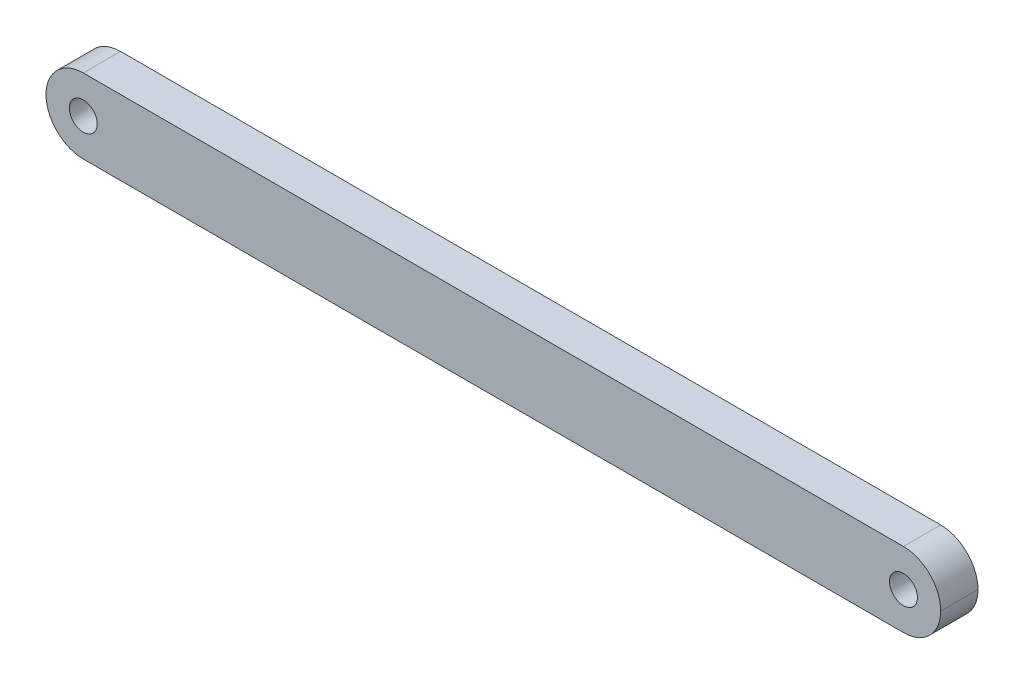
ISO-10303-21;
HEADER;
FILE_DESCRIPTION(('STEP AP214'),'2;1');
FILE_NAME('part.step','',(''),(''),'','','');
FILE_SCHEMA(('AUTOMOTIVE_DESIGN { 1 0 10303 214 1 1 1 1 }'));
ENDSEC;
DATA;
#1=APPLICATION_CONTEXT('core data for automotive mechanical design processes');
#2=APPLICATION_PROTOCOL_DEFINITION('international standard','automotive_design',2000,#1);
#3=PRODUCT_CONTEXT('',#1,'mechanical');
#4=PRODUCT('Part','Part','',(#3));
#5=PRODUCT_RELATED_PRODUCT_CATEGORY('part','',(#4));
#6=PRODUCT_DEFINITION_FORMATION('','',#4);
#7=PRODUCT_DEFINITION_CONTEXT('part definition',#1,'design');
#8=PRODUCT_DEFINITION('design','',#6,#7);
#9=PRODUCT_DEFINITION_SHAPE('','',#8);
#10=(LENGTH_UNIT() NAMED_UNIT(*) SI_UNIT(.MILLI.,.METRE.));
#11=(NAMED_UNIT(*) PLANE_ANGLE_UNIT() SI_UNIT($,.RADIAN.));
#12=(NAMED_UNIT(*) SI_UNIT($,.STERADIAN.) SOLID_ANGLE_UNIT());
#13=UNCERTAINTY_MEASURE_WITH_UNIT(LENGTH_MEASURE(1.E-05),#10,'distance_accuracy_value','');
#14=(GEOMETRIC_REPRESENTATION_CONTEXT(3) GLOBAL_UNCERTAINTY_ASSIGNED_CONTEXT((#13)) GLOBAL_UNIT_ASSIGNED_CONTEXT((#10,
#11,#12)) REPRESENTATION_CONTEXT('',''));
#15=CARTESIAN_POINT('',(0.,0.,0.));
#16=DIRECTION('',(0.,0.,1.));
#17=DIRECTION('',(1.,0.,0.));
#18=AXIS2_PLACEMENT_3D('',#15,#16,#17);
#19=CARTESIAN_POINT('',(0.,0.,6.35));
#20=DIRECTION('',(0.,1.,0.));
#21=DIRECTION('',(0.,0.,1.));
#22=AXIS2_PLACEMENT_3D('',#19,#20,#21);
#23=PLANE('',#22);
#24=DIRECTION('',(1.,0.,0.));
#25=VECTOR('',#24,1.);
#26=CARTESIAN_POINT('',(0.,0.,6.35));
#27=LINE('',#26,#25);
#28=CARTESIAN_POINT('',(6.35,0.,6.35));
#29=VERTEX_POINT('',#28);
#30=CARTESIAN_POINT('',(146.05,0.,6.35));
#31=VERTEX_POINT('',#30);
#32=EDGE_CURVE('E106',#29,#31,#27,.T.);
#33=ORIENTED_EDGE('',*,*,#32,.F.);
#34=DIRECTION('',(0.,0.,-1.));
#35=VECTOR('',#34,1.);
#36=CARTESIAN_POINT('',(6.35,0.,6.35));
#37=LINE('',#36,#35);
#38=CARTESIAN_POINT('',(6.35,0.,0.));
#39=VERTEX_POINT('',#38);
#40=EDGE_CURVE('E91',#29,#39,#37,.T.);
#41=ORIENTED_EDGE('',*,*,#40,.T.);
#42=DIRECTION('',(1.,0.,0.));
#43=VECTOR('',#42,1.);
#44=CARTESIAN_POINT('',(0.,0.,0.));
#45=LINE('',#44,#43);
#46=CARTESIAN_POINT('',(146.05,0.,0.));
#47=VERTEX_POINT('',#46);
#48=EDGE_CURVE('E103',#39,#47,#45,.T.);
#49=ORIENTED_EDGE('',*,*,#48,.T.);
#50=DIRECTION('',(0.,0.,-1.));
#51=VECTOR('',#50,1.);
#52=CARTESIAN_POINT('',(146.05,0.,6.35));
#53=LINE('',#52,#51);
#54=EDGE_CURVE('E108',#47,#31,#53,.F.);
#55=ORIENTED_EDGE('',*,*,#54,.T.);
#56=EDGE_LOOP('',(#33,#41,#49,#55));
#57=FACE_BOUND('',#56,.T.);
#58=ADVANCED_FACE('F33',(#57),#23,.F.);
#59=CARTESIAN_POINT('',(0.,12.7,6.35));
#60=DIRECTION('',(0.,-1.,0.));
#61=DIRECTION('',(0.,0.,-1.));
#62=AXIS2_PLACEMENT_3D('',#59,#60,#61);
#63=PLANE('',#62);
#64=DIRECTION('',(-1.,0.,0.));
#65=VECTOR('',#64,1.);
#66=CARTESIAN_POINT('',(0.,12.7,0.));
#67=LINE('',#66,#65);
#68=CARTESIAN_POINT('',(146.05,12.7,0.));
#69=VERTEX_POINT('',#68);
#70=CARTESIAN_POINT('',(6.35,12.7,0.));
#71=VERTEX_POINT('',#70);
#72=EDGE_CURVE('E113',#69,#71,#67,.T.);
#73=ORIENTED_EDGE('',*,*,#72,.T.);
#74=DIRECTION('',(0.,0.,-1.));
#75=VECTOR('',#74,1.);
#76=CARTESIAN_POINT('',(6.35,12.7,6.35));
#77=LINE('',#76,#75);
#78=CARTESIAN_POINT('',(6.35,12.7,6.35));
#79=VERTEX_POINT('',#78);
#80=EDGE_CURVE('E11',#71,#79,#77,.F.);
#81=ORIENTED_EDGE('',*,*,#80,.T.);
#82=DIRECTION('',(-1.,0.,0.));
#83=VECTOR('',#82,1.);
#84=CARTESIAN_POINT('',(0.,12.7,6.35));
#85=LINE('',#84,#83);
#86=CARTESIAN_POINT('',(146.05,12.7,6.35));
#87=VERTEX_POINT('',#86);
#88=EDGE_CURVE('E119',#87,#79,#85,.T.);
#89=ORIENTED_EDGE('',*,*,#88,.F.);
#90=DIRECTION('',(0.,0.,-1.));
#91=VECTOR('',#90,1.);
#92=CARTESIAN_POINT('',(146.05,12.7,6.35));
#93=LINE('',#92,#91);
#94=EDGE_CURVE('E42',#87,#69,#93,.T.);
#95=ORIENTED_EDGE('',*,*,#94,.T.);
#96=EDGE_LOOP('',(#73,#81,#89,#95));
#97=FACE_BOUND('',#96,.T.);
#98=ADVANCED_FACE('F154',(#97),#63,.F.);
#99=CARTESIAN_POINT('',(0.,0.,6.35));
#100=DIRECTION('',(0.,0.,-1.));
#101=DIRECTION('',(-1.,0.,0.));
#102=AXIS2_PLACEMENT_3D('',#99,#100,#101);
#103=PLANE('',#102);
#104=CARTESIAN_POINT('',(146.05,6.35,6.35));
#105=DIRECTION('',(0.,0.,1.));
#106=DIRECTION('',(1.,0.,0.));
#107=AXIS2_PLACEMENT_3D('',#104,#105,#106);
#108=CIRCLE('',#107,2.38125000000001);
#109=CARTESIAN_POINT('',(148.43125,6.35,6.35));
#110=VERTEX_POINT('',#109);
#111=EDGE_CURVE('E145',#110,#110,#108,.T.);
#112=ORIENTED_EDGE('',*,*,#111,.F.);
#113=EDGE_LOOP('',(#112));
#114=FACE_BOUND('',#113,.T.);
#115=CARTESIAN_POINT('',(6.35,6.35,6.35));
#116=DIRECTION('',(0.,0.,1.));
#117=DIRECTION('',(1.,0.,0.));
#118=AXIS2_PLACEMENT_3D('',#115,#116,#117);
#119=CIRCLE('',#118,2.38125);
#120=CARTESIAN_POINT('',(8.73125,6.35,6.35));
#121=VERTEX_POINT('',#120);
#122=EDGE_CURVE('E137',#121,#121,#119,.T.);
#123=ORIENTED_EDGE('',*,*,#122,.F.);
#124=EDGE_LOOP('',(#123));
#125=FACE_BOUND('',#124,.T.);
#126=CARTESIAN_POINT('',(6.35,6.35,6.35));
#127=DIRECTION('',(0.,0.,-1.));
#128=DIRECTION('',(-1.,0.,0.));
#129=AXIS2_PLACEMENT_3D('',#126,#127,#128);
#130=CIRCLE('',#129,6.35);
#131=CARTESIAN_POINT('',(0.,6.35,6.35));
#132=VERTEX_POINT('',#131);
#133=EDGE_CURVE('E129',#79,#132,#130,.F.);
#134=ORIENTED_EDGE('',*,*,#133,.T.);
#135=CARTESIAN_POINT('',(6.35,6.35,6.35));
#136=DIRECTION('',(0.,0.,-1.));
#137=DIRECTION('',(-1.,0.,0.));
#138=AXIS2_PLACEMENT_3D('',#135,#136,#137);
#139=CIRCLE('',#138,6.35);
#140=EDGE_CURVE('E131',#132,#29,#139,.F.);
#141=ORIENTED_EDGE('',*,*,#140,.T.);
#142=ORIENTED_EDGE('',*,*,#32,.T.);
#143=CARTESIAN_POINT('',(146.05,6.35,6.35));
#144=DIRECTION('',(0.,0.,-1.));
#145=DIRECTION('',(-1.,0.,0.));
#146=AXIS2_PLACEMENT_3D('',#143,#144,#145);
#147=CIRCLE('',#146,6.35);
#148=CARTESIAN_POINT('',(152.4,6.35,6.35));
#149=VERTEX_POINT('',#148);
#150=EDGE_CURVE('E127',#31,#149,#147,.F.);
#151=ORIENTED_EDGE('',*,*,#150,.T.);
#152=CARTESIAN_POINT('',(146.05,6.35,6.35));
#153=DIRECTION('',(0.,0.,-1.));
#154=DIRECTION('',(-1.,0.,0.));
#155=AXIS2_PLACEMENT_3D('',#152,#153,#154);
#156=CIRCLE('',#155,6.35);
#157=EDGE_CURVE('E55',#149,#87,#156,.F.);
#158=ORIENTED_EDGE('',*,*,#157,.T.);
#159=ORIENTED_EDGE('',*,*,#88,.T.);
#160=EDGE_LOOP('',(#134,#141,#142,#151,#158,#159));
#161=FACE_BOUND('',#160,.T.);
#162=ADVANCED_FACE('F148',(#114,#125,#161),#103,.F.);
#163=CARTESIAN_POINT('',(0.,0.,0.));
#164=DIRECTION('',(0.,0.,-1.));
#165=DIRECTION('',(-1.,0.,0.));
#166=AXIS2_PLACEMENT_3D('',#163,#164,#165);
#167=PLANE('',#166);
#168=CARTESIAN_POINT('',(146.05,6.35,0.));
#169=DIRECTION('',(0.,0.,-1.));
#170=DIRECTION('',(-1.,0.,0.));
#171=AXIS2_PLACEMENT_3D('',#168,#169,#170);
#172=CIRCLE('',#171,2.38125000000001);
#173=CARTESIAN_POINT('',(143.66875,6.35,0.));
#174=VERTEX_POINT('',#173);
#175=EDGE_CURVE('E37',#174,#174,#172,.T.);
#176=ORIENTED_EDGE('',*,*,#175,.F.);
#177=EDGE_LOOP('',(#176));
#178=FACE_BOUND('',#177,.T.);
#179=CARTESIAN_POINT('',(6.35,6.35,0.));
#180=DIRECTION('',(0.,0.,-1.));
#181=DIRECTION('',(-1.,0.,0.));
#182=AXIS2_PLACEMENT_3D('',#179,#180,#181);
#183=CIRCLE('',#182,2.38125);
#184=CARTESIAN_POINT('',(3.96875,6.35,0.));
#185=VERTEX_POINT('',#184);
#186=EDGE_CURVE('E135',#185,#185,#183,.T.);
#187=ORIENTED_EDGE('',*,*,#186,.F.);
#188=EDGE_LOOP('',(#187));
#189=FACE_BOUND('',#188,.T.);
#190=ORIENTED_EDGE('',*,*,#48,.F.);
#191=CARTESIAN_POINT('',(6.35,6.35,0.));
#192=DIRECTION('',(0.,0.,-1.));
#193=DIRECTION('',(-1.,0.,0.));
#194=AXIS2_PLACEMENT_3D('',#191,#192,#193);
#195=CIRCLE('',#194,6.35);
#196=CARTESIAN_POINT('',(0.,6.35,0.));
#197=VERTEX_POINT('',#196);
#198=EDGE_CURVE('E87',#39,#197,#195,.T.);
#199=ORIENTED_EDGE('',*,*,#198,.T.);
#200=CARTESIAN_POINT('',(6.35,6.35,0.));
#201=DIRECTION('',(0.,0.,-1.));
#202=DIRECTION('',(-1.,0.,0.));
#203=AXIS2_PLACEMENT_3D('',#200,#201,#202);
#204=CIRCLE('',#203,6.35);
#205=EDGE_CURVE('E97',#197,#71,#204,.T.);
#206=ORIENTED_EDGE('',*,*,#205,.T.);
#207=ORIENTED_EDGE('',*,*,#72,.F.);
#208=CARTESIAN_POINT('',(146.05,6.35,0.));
#209=DIRECTION('',(0.,0.,-1.));
#210=DIRECTION('',(-1.,0.,0.));
#211=AXIS2_PLACEMENT_3D('',#208,#209,#210);
#212=CIRCLE('',#211,6.35);
#213=CARTESIAN_POINT('',(152.4,6.35,0.));
#214=VERTEX_POINT('',#213);
#215=EDGE_CURVE('E107',#69,#214,#212,.T.);
#216=ORIENTED_EDGE('',*,*,#215,.T.);
#217=CARTESIAN_POINT('',(146.05,6.35,0.));
#218=DIRECTION('',(0.,0.,-1.));
#219=DIRECTION('',(-1.,0.,0.));
#220=AXIS2_PLACEMENT_3D('',#217,#218,#219);
#221=CIRCLE('',#220,6.35);
#222=EDGE_CURVE('E112',#214,#47,#221,.T.);
#223=ORIENTED_EDGE('',*,*,#222,.T.);
#224=EDGE_LOOP('',(#190,#199,#206,#207,#216,#223));
#225=FACE_BOUND('',#224,.T.);
#226=ADVANCED_FACE('F110',(#178,#189,#225),#167,.T.);
#227=CARTESIAN_POINT('',(6.35,6.35,6.35));
#228=DIRECTION('',(0.,0.,-1.));
#229=DIRECTION('',(-1.,0.,0.));
#230=AXIS2_PLACEMENT_3D('',#227,#228,#229);
#231=CYLINDRICAL_SURFACE('',#230,6.35);
#232=DIRECTION('',(0.,0.,-1.));
#233=VECTOR('',#232,1.);
#234=CARTESIAN_POINT('',(0.,6.35,6.35));
#235=LINE('',#234,#233);
#236=EDGE_CURVE('E93',#132,#197,#235,.T.);
#237=ORIENTED_EDGE('',*,*,#236,.F.);
#238=ORIENTED_EDGE('',*,*,#133,.F.);
#239=ORIENTED_EDGE('',*,*,#80,.F.);
#240=ORIENTED_EDGE('',*,*,#205,.F.);
#241=EDGE_LOOP('',(#237,#238,#239,#240));
#242=FACE_BOUND('',#241,.T.);
#243=ADVANCED_FACE('F151',(#242),#231,.T.);
#244=CARTESIAN_POINT('',(6.35,6.35,6.35));
#245=DIRECTION('',(0.,0.,-1.));
#246=DIRECTION('',(-1.,0.,0.));
#247=AXIS2_PLACEMENT_3D('',#244,#245,#246);
#248=CYLINDRICAL_SURFACE('',#247,6.35);
#249=ORIENTED_EDGE('',*,*,#140,.F.);
#250=ORIENTED_EDGE('',*,*,#236,.T.);
#251=ORIENTED_EDGE('',*,*,#198,.F.);
#252=ORIENTED_EDGE('',*,*,#40,.F.);
#253=EDGE_LOOP('',(#249,#250,#251,#252));
#254=FACE_BOUND('',#253,.T.);
#255=ADVANCED_FACE('F90',(#254),#248,.T.);
#256=CARTESIAN_POINT('',(146.05,6.35,6.35));
#257=DIRECTION('',(0.,0.,-1.));
#258=DIRECTION('',(-1.,0.,0.));
#259=AXIS2_PLACEMENT_3D('',#256,#257,#258);
#260=CYLINDRICAL_SURFACE('',#259,6.35);
#261=ORIENTED_EDGE('',*,*,#94,.F.);
#262=ORIENTED_EDGE('',*,*,#157,.F.);
#263=DIRECTION('',(0.,0.,-1.));
#264=VECTOR('',#263,1.);
#265=CARTESIAN_POINT('',(152.4,6.35,6.35));
#266=LINE('',#265,#264);
#267=EDGE_CURVE('E116',#214,#149,#266,.F.);
#268=ORIENTED_EDGE('',*,*,#267,.F.);
#269=ORIENTED_EDGE('',*,*,#215,.F.);
#270=EDGE_LOOP('',(#261,#262,#268,#269));
#271=FACE_BOUND('',#270,.T.);
#272=ADVANCED_FACE('F35',(#271),#260,.T.);
#273=CARTESIAN_POINT('',(146.05,6.35,6.35));
#274=DIRECTION('',(0.,0.,-1.));
#275=DIRECTION('',(-1.,0.,0.));
#276=AXIS2_PLACEMENT_3D('',#273,#274,#275);
#277=CYLINDRICAL_SURFACE('',#276,6.35);
#278=ORIENTED_EDGE('',*,*,#150,.F.);
#279=ORIENTED_EDGE('',*,*,#54,.F.);
#280=ORIENTED_EDGE('',*,*,#222,.F.);
#281=ORIENTED_EDGE('',*,*,#267,.T.);
#282=EDGE_LOOP('',(#278,#279,#280,#281));
#283=FACE_BOUND('',#282,.T.);
#284=ADVANCED_FACE('F158',(#283),#277,.T.);
#285=CARTESIAN_POINT('',(6.35,6.35,-19.05));
#286=DIRECTION('',(0.,0.,1.));
#287=DIRECTION('',(1.,0.,0.));
#288=AXIS2_PLACEMENT_3D('',#285,#286,#287);
#289=CYLINDRICAL_SURFACE('',#288,2.38125);
#290=ORIENTED_EDGE('',*,*,#186,.T.);
#291=EDGE_LOOP('',(#290));
#292=FACE_BOUND('',#291,.T.);
#293=ORIENTED_EDGE('',*,*,#122,.T.);
#294=EDGE_LOOP('',(#293));
#295=FACE_BOUND('',#294,.T.);
#296=ADVANCED_FACE('F160',(#292,#295),#289,.F.);
#297=CARTESIAN_POINT('',(146.05,6.35,-19.05));
#298=DIRECTION('',(0.,0.,1.));
#299=DIRECTION('',(1.,0.,0.));
#300=AXIS2_PLACEMENT_3D('',#297,#298,#299);
#301=CYLINDRICAL_SURFACE('',#300,2.38125000000001);
#302=ORIENTED_EDGE('',*,*,#175,.T.);
#303=EDGE_LOOP('',(#302));
#304=FACE_BOUND('',#303,.T.);
#305=ORIENTED_EDGE('',*,*,#111,.T.);
#306=EDGE_LOOP('',(#305));
#307=FACE_BOUND('',#306,.T.);
#308=ADVANCED_FACE('F165',(#304,#307),#301,.F.);
#309=CLOSED_SHELL('',(#58,#98,#162,#226,#243,#255,#272,#284,#296,#308));
#310=MANIFOLD_SOLID_BREP('B2',#309);
#311=ADVANCED_BREP_SHAPE_REPRESENTATION('',(#18,#310),#14);
#312=SHAPE_DEFINITION_REPRESENTATION(#9,#311);
ENDSEC;
END-ISO-10303-21;
